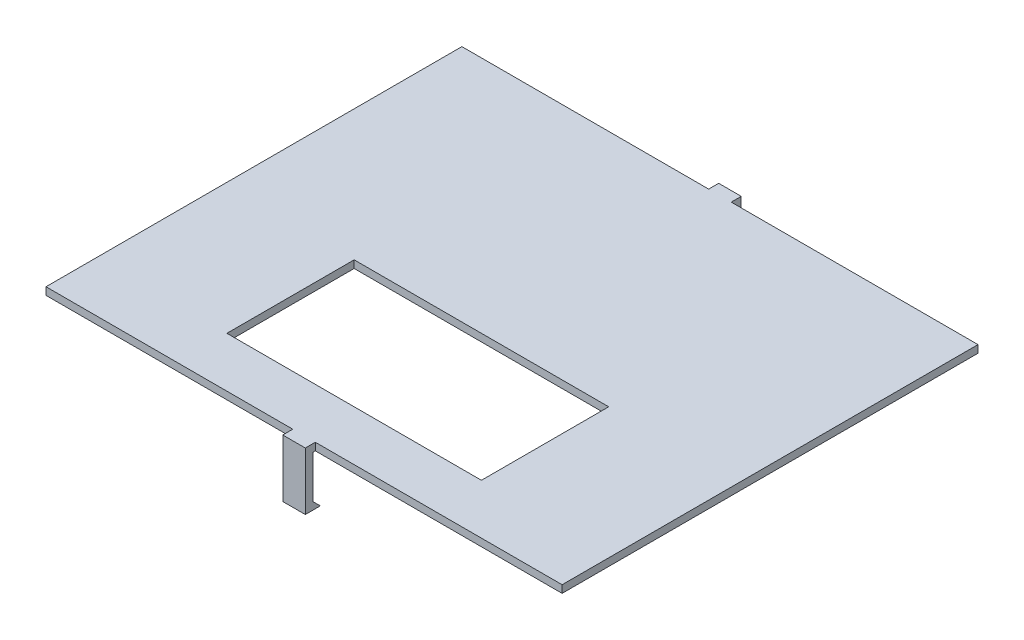
ISO-10303-21;
HEADER;
FILE_DESCRIPTION(('STEP AP214'),'2;1');
FILE_NAME('part.step','',(''),(''),'','','');
FILE_SCHEMA(('AUTOMOTIVE_DESIGN { 1 0 10303 214 1 1 1 1 }'));
ENDSEC;
DATA;
#1=APPLICATION_CONTEXT('core data for automotive mechanical design processes');
#2=APPLICATION_PROTOCOL_DEFINITION('international standard','automotive_design',2000,#1);
#3=PRODUCT_CONTEXT('',#1,'mechanical');
#4=PRODUCT('Part','Part','',(#3));
#5=PRODUCT_RELATED_PRODUCT_CATEGORY('part','',(#4));
#6=PRODUCT_DEFINITION_FORMATION('','',#4);
#7=PRODUCT_DEFINITION_CONTEXT('part definition',#1,'design');
#8=PRODUCT_DEFINITION('design','',#6,#7);
#9=PRODUCT_DEFINITION_SHAPE('','',#8);
#10=(LENGTH_UNIT() NAMED_UNIT(*) SI_UNIT(.MILLI.,.METRE.));
#11=(NAMED_UNIT(*) PLANE_ANGLE_UNIT() SI_UNIT($,.RADIAN.));
#12=(NAMED_UNIT(*) SI_UNIT($,.STERADIAN.) SOLID_ANGLE_UNIT());
#13=UNCERTAINTY_MEASURE_WITH_UNIT(LENGTH_MEASURE(1.E-05),#10,'distance_accuracy_value','');
#14=(GEOMETRIC_REPRESENTATION_CONTEXT(3) GLOBAL_UNCERTAINTY_ASSIGNED_CONTEXT((#13)) GLOBAL_UNIT_ASSIGNED_CONTEXT((#10,
#11,#12)) REPRESENTATION_CONTEXT('',''));
#15=CARTESIAN_POINT('',(0.,0.,0.));
#16=DIRECTION('',(0.,0.,1.));
#17=DIRECTION('',(1.,0.,0.));
#18=AXIS2_PLACEMENT_3D('',#15,#16,#17);
#19=CARTESIAN_POINT('',(-33.2076502732241,1.5,-29.4084699453552));
#20=DIRECTION('',(0.,0.,1.));
#21=DIRECTION('',(1.,0.,0.));
#22=AXIS2_PLACEMENT_3D('',#19,#20,#21);
#23=PLANE('',#22);
#24=DIRECTION('',(0.,-1.,0.));
#25=VECTOR('',#24,1.);
#26=CARTESIAN_POINT('',(20.5423497267759,0.,-29.4084699453552));
#27=LINE('',#26,#25);
#28=CARTESIAN_POINT('',(20.5423497267759,1.5,-29.4084699453552));
#29=VERTEX_POINT('',#28);
#30=CARTESIAN_POINT('',(20.5423497267759,0.,-29.4084699453552));
#31=VERTEX_POINT('',#30);
#32=EDGE_CURVE('E234',#29,#31,#27,.T.);
#33=ORIENTED_EDGE('',*,*,#32,.F.);
#34=DIRECTION('',(-1.,0.,0.));
#35=VECTOR('',#34,1.);
#36=CARTESIAN_POINT('',(-33.2076502732241,1.5,-29.4084699453552));
#37=LINE('',#36,#35);
#38=CARTESIAN_POINT('',(69.792349726776,1.5,-29.4084699453552));
#39=VERTEX_POINT('',#38);
#40=EDGE_CURVE('E325',#39,#29,#37,.T.);
#41=ORIENTED_EDGE('',*,*,#40,.F.);
#42=DIRECTION('',(0.,-1.,0.));
#43=VECTOR('',#42,1.);
#44=CARTESIAN_POINT('',(69.792349726776,1.5,-29.4084699453552));
#45=LINE('',#44,#43);
#46=CARTESIAN_POINT('',(69.792349726776,0.,-29.4084699453552));
#47=VERTEX_POINT('',#46);
#48=EDGE_CURVE('E340',#39,#47,#45,.T.);
#49=ORIENTED_EDGE('',*,*,#48,.T.);
#50=DIRECTION('',(-1.,0.,0.));
#51=VECTOR('',#50,1.);
#52=CARTESIAN_POINT('',(-33.2076502732241,0.,-29.4084699453552));
#53=LINE('',#52,#51);
#54=EDGE_CURVE('E318',#47,#31,#53,.T.);
#55=ORIENTED_EDGE('',*,*,#54,.T.);
#56=EDGE_LOOP('',(#33,#41,#49,#55));
#57=FACE_BOUND('',#56,.T.);
#58=ADVANCED_FACE('F33',(#57),#23,.F.);
#59=CARTESIAN_POINT('',(-33.207650273224,1.5,53.5915300546448));
#60=DIRECTION('',(0.,0.,-1.));
#61=DIRECTION('',(-1.,0.,0.));
#62=AXIS2_PLACEMENT_3D('',#59,#60,#61);
#63=PLANE('',#62);
#64=DIRECTION('',(0.,1.,0.));
#65=VECTOR('',#64,1.);
#66=CARTESIAN_POINT('',(16.042349726776,0.,53.5915300546448));
#67=LINE('',#66,#65);
#68=CARTESIAN_POINT('',(16.042349726776,0.,53.5915300546448));
#69=VERTEX_POINT('',#68);
#70=CARTESIAN_POINT('',(16.042349726776,1.5,53.5915300546448));
#71=VERTEX_POINT('',#70);
#72=EDGE_CURVE('E267',#69,#71,#67,.T.);
#73=ORIENTED_EDGE('',*,*,#72,.T.);
#74=DIRECTION('',(1.,0.,0.));
#75=VECTOR('',#74,1.);
#76=CARTESIAN_POINT('',(-33.207650273224,1.5,53.5915300546448));
#77=LINE('',#76,#75);
#78=CARTESIAN_POINT('',(-33.207650273224,1.5,53.5915300546448));
#79=VERTEX_POINT('',#78);
#80=EDGE_CURVE('E319',#79,#71,#77,.T.);
#81=ORIENTED_EDGE('',*,*,#80,.F.);
#82=DIRECTION('',(0.,-1.,0.));
#83=VECTOR('',#82,1.);
#84=CARTESIAN_POINT('',(-33.207650273224,1.5,53.5915300546448));
#85=LINE('',#84,#83);
#86=CARTESIAN_POINT('',(-33.207650273224,0.,53.5915300546448));
#87=VERTEX_POINT('',#86);
#88=EDGE_CURVE('E11',#79,#87,#85,.T.);
#89=ORIENTED_EDGE('',*,*,#88,.T.);
#90=DIRECTION('',(1.,0.,0.));
#91=VECTOR('',#90,1.);
#92=CARTESIAN_POINT('',(-33.207650273224,0.,53.5915300546448));
#93=LINE('',#92,#91);
#94=EDGE_CURVE('E332',#87,#69,#93,.T.);
#95=ORIENTED_EDGE('',*,*,#94,.T.);
#96=EDGE_LOOP('',(#73,#81,#89,#95));
#97=FACE_BOUND('',#96,.T.);
#98=ADVANCED_FACE('F383',(#97),#63,.F.);
#99=CARTESIAN_POINT('',(-33.2076502732241,1.5,-29.4084699453552));
#100=DIRECTION('',(1.,0.,0.));
#101=DIRECTION('',(0.,0.,-1.));
#102=AXIS2_PLACEMENT_3D('',#99,#100,#101);
#103=PLANE('',#102);
#104=DIRECTION('',(0.,0.,1.));
#105=VECTOR('',#104,1.);
#106=CARTESIAN_POINT('',(-33.2076502732241,0.,-29.4084699453552));
#107=LINE('',#106,#105);
#108=CARTESIAN_POINT('',(-33.2076502732241,0.,-29.4084699453552));
#109=VERTEX_POINT('',#108);
#110=EDGE_CURVE('E313',#109,#87,#107,.T.);
#111=ORIENTED_EDGE('',*,*,#110,.T.);
#112=ORIENTED_EDGE('',*,*,#88,.F.);
#113=DIRECTION('',(0.,0.,1.));
#114=VECTOR('',#113,1.);
#115=CARTESIAN_POINT('',(-33.2076502732241,1.5,-29.4084699453552));
#116=LINE('',#115,#114);
#117=CARTESIAN_POINT('',(-33.2076502732241,1.5,-29.4084699453552));
#118=VERTEX_POINT('',#117);
#119=EDGE_CURVE('E314',#118,#79,#116,.T.);
#120=ORIENTED_EDGE('',*,*,#119,.F.);
#121=DIRECTION('',(0.,-1.,0.));
#122=VECTOR('',#121,1.);
#123=CARTESIAN_POINT('',(-33.2076502732241,1.5,-29.4084699453552));
#124=LINE('',#123,#122);
#125=EDGE_CURVE('E328',#118,#109,#124,.T.);
#126=ORIENTED_EDGE('',*,*,#125,.T.);
#127=EDGE_LOOP('',(#111,#112,#120,#126));
#128=FACE_BOUND('',#127,.T.);
#129=ADVANCED_FACE('F35',(#128),#103,.F.);
#130=CARTESIAN_POINT('',(20.542349726776,1.5,53.5915300546448));
#131=VERTEX_POINT('',#130);
#132=CARTESIAN_POINT('',(69.792349726776,1.5,53.5915300546448));
#133=VERTEX_POINT('',#132);
#134=EDGE_CURVE('E317',#131,#133,#77,.T.);
#135=ORIENTED_EDGE('',*,*,#134,.F.);
#136=DIRECTION('',(0.,1.,0.));
#137=VECTOR('',#136,1.);
#138=CARTESIAN_POINT('',(20.542349726776,0.,53.5915300546448));
#139=LINE('',#138,#137);
#140=CARTESIAN_POINT('',(20.542349726776,0.,53.5915300546448));
#141=VERTEX_POINT('',#140);
#142=EDGE_CURVE('E268',#141,#131,#139,.T.);
#143=ORIENTED_EDGE('',*,*,#142,.F.);
#144=CARTESIAN_POINT('',(69.792349726776,0.,53.5915300546448));
#145=VERTEX_POINT('',#144);
#146=EDGE_CURVE('E331',#141,#145,#93,.T.);
#147=ORIENTED_EDGE('',*,*,#146,.T.);
#148=DIRECTION('',(0.,-1.,0.));
#149=VECTOR('',#148,1.);
#150=CARTESIAN_POINT('',(69.792349726776,1.5,53.5915300546448));
#151=LINE('',#150,#149);
#152=EDGE_CURVE('E41',#133,#145,#151,.T.);
#153=ORIENTED_EDGE('',*,*,#152,.F.);
#154=EDGE_LOOP('',(#135,#143,#147,#153));
#155=FACE_BOUND('',#154,.T.);
#156=ADVANCED_FACE('F368',(#155),#63,.F.);
#157=CARTESIAN_POINT('',(69.792349726776,1.5,-29.4084699453552));
#158=DIRECTION('',(-1.,0.,0.));
#159=DIRECTION('',(0.,0.,1.));
#160=AXIS2_PLACEMENT_3D('',#157,#158,#159);
#161=PLANE('',#160);
#162=DIRECTION('',(0.,0.,-1.));
#163=VECTOR('',#162,1.);
#164=CARTESIAN_POINT('',(69.792349726776,0.,-29.4084699453552));
#165=LINE('',#164,#163);
#166=EDGE_CURVE('E334',#145,#47,#165,.T.);
#167=ORIENTED_EDGE('',*,*,#166,.T.);
#168=ORIENTED_EDGE('',*,*,#48,.F.);
#169=DIRECTION('',(0.,0.,-1.));
#170=VECTOR('',#169,1.);
#171=CARTESIAN_POINT('',(69.792349726776,1.5,-29.4084699453552));
#172=LINE('',#171,#170);
#173=EDGE_CURVE('E322',#133,#39,#172,.T.);
#174=ORIENTED_EDGE('',*,*,#173,.F.);
#175=ORIENTED_EDGE('',*,*,#152,.T.);
#176=EDGE_LOOP('',(#167,#168,#174,#175));
#177=FACE_BOUND('',#176,.T.);
#178=ADVANCED_FACE('F347',(#177),#161,.F.);
#179=CARTESIAN_POINT('',(16.0423497267759,1.5,-29.4084699453552));
#180=VERTEX_POINT('',#179);
#181=EDGE_CURVE('E324',#180,#118,#37,.T.);
#182=ORIENTED_EDGE('',*,*,#181,.F.);
#183=DIRECTION('',(0.,-1.,0.));
#184=VECTOR('',#183,1.);
#185=CARTESIAN_POINT('',(16.0423497267759,0.,-29.4084699453552));
#186=LINE('',#185,#184);
#187=CARTESIAN_POINT('',(16.0423497267759,0.,-29.4084699453552));
#188=VERTEX_POINT('',#187);
#189=EDGE_CURVE('E223',#180,#188,#186,.T.);
#190=ORIENTED_EDGE('',*,*,#189,.T.);
#191=EDGE_CURVE('E336',#188,#109,#53,.T.);
#192=ORIENTED_EDGE('',*,*,#191,.T.);
#193=ORIENTED_EDGE('',*,*,#125,.F.);
#194=EDGE_LOOP('',(#182,#190,#192,#193));
#195=FACE_BOUND('',#194,.T.);
#196=ADVANCED_FACE('F391',(#195),#23,.F.);
#197=CARTESIAN_POINT('',(0.,1.5,0.));
#198=DIRECTION('',(0.,1.,0.));
#199=DIRECTION('',(0.,0.,1.));
#200=AXIS2_PLACEMENT_3D('',#197,#198,#199);
#201=PLANE('',#200);
#202=DIRECTION('',(0.,0.,1.));
#203=VECTOR('',#202,1.);
#204=CARTESIAN_POINT('',(-7.10765027322404,1.5,18.1915300546448));
#205=LINE('',#204,#203);
#206=CARTESIAN_POINT('',(-7.10765027322404,1.5,18.1915300546448));
#207=VERTEX_POINT('',#206);
#208=CARTESIAN_POINT('',(-7.10765027322404,1.5,43.5915300546448));
#209=VERTEX_POINT('',#208);
#210=EDGE_CURVE('E48',#207,#209,#205,.T.);
#211=ORIENTED_EDGE('',*,*,#210,.F.);
#212=DIRECTION('',(-1.,0.,0.));
#213=VECTOR('',#212,1.);
#214=CARTESIAN_POINT('',(-7.10765027322404,1.5,18.1915300546448));
#215=LINE('',#214,#213);
#216=CARTESIAN_POINT('',(43.692349726776,1.5,18.1915300546448));
#217=VERTEX_POINT('',#216);
#218=EDGE_CURVE('E200',#217,#207,#215,.T.);
#219=ORIENTED_EDGE('',*,*,#218,.F.);
#220=DIRECTION('',(0.,0.,-1.));
#221=VECTOR('',#220,1.);
#222=CARTESIAN_POINT('',(43.692349726776,1.5,18.1915300546448));
#223=LINE('',#222,#221);
#224=CARTESIAN_POINT('',(43.692349726776,1.5,43.5915300546448));
#225=VERTEX_POINT('',#224);
#226=EDGE_CURVE('E203',#225,#217,#223,.T.);
#227=ORIENTED_EDGE('',*,*,#226,.F.);
#228=DIRECTION('',(1.,0.,0.));
#229=VECTOR('',#228,1.);
#230=CARTESIAN_POINT('',(-7.10765027322404,1.5,43.5915300546448));
#231=LINE('',#230,#229);
#232=EDGE_CURVE('E209',#209,#225,#231,.T.);
#233=ORIENTED_EDGE('',*,*,#232,.F.);
#234=EDGE_LOOP('',(#211,#219,#227,#233));
#235=FACE_BOUND('',#234,.T.);
#236=ORIENTED_EDGE('',*,*,#119,.T.);
#237=ORIENTED_EDGE('',*,*,#80,.T.);
#238=DIRECTION('',(0.,0.,1.));
#239=VECTOR('',#238,1.);
#240=CARTESIAN_POINT('',(16.042349726776,1.5,53.5915300546448));
#241=LINE('',#240,#239);
#242=CARTESIAN_POINT('',(16.042349726776,1.5,55.5915300546448));
#243=VERTEX_POINT('',#242);
#244=EDGE_CURVE('E287',#71,#243,#241,.T.);
#245=ORIENTED_EDGE('',*,*,#244,.T.);
#246=DIRECTION('',(-1.,0.,0.));
#247=VECTOR('',#246,1.);
#248=CARTESIAN_POINT('',(20.542349726776,1.5,55.5915300546448));
#249=LINE('',#248,#247);
#250=CARTESIAN_POINT('',(20.542349726776,1.5,55.5915300546448));
#251=VERTEX_POINT('',#250);
#252=EDGE_CURVE('E310',#251,#243,#249,.T.);
#253=ORIENTED_EDGE('',*,*,#252,.F.);
#254=DIRECTION('',(0.,0.,1.));
#255=VECTOR('',#254,1.);
#256=CARTESIAN_POINT('',(20.542349726776,1.5,53.5915300546448));
#257=LINE('',#256,#255);
#258=EDGE_CURVE('E271',#131,#251,#257,.T.);
#259=ORIENTED_EDGE('',*,*,#258,.F.);
#260=ORIENTED_EDGE('',*,*,#134,.T.);
#261=ORIENTED_EDGE('',*,*,#173,.T.);
#262=ORIENTED_EDGE('',*,*,#40,.T.);
#263=DIRECTION('',(0.,0.,1.));
#264=VECTOR('',#263,1.);
#265=CARTESIAN_POINT('',(20.5423497267759,1.50000000000001,-29.4084699453552));
#266=LINE('',#265,#264);
#267=CARTESIAN_POINT('',(20.5423497267759,1.50000000000001,-31.4084699453552));
#268=VERTEX_POINT('',#267);
#269=EDGE_CURVE('E231',#268,#29,#266,.T.);
#270=ORIENTED_EDGE('',*,*,#269,.F.);
#271=DIRECTION('',(-1.,0.,0.));
#272=VECTOR('',#271,1.);
#273=CARTESIAN_POINT('',(20.5423497267759,1.50000000000001,-31.4084699453552));
#274=LINE('',#273,#272);
#275=CARTESIAN_POINT('',(16.0423497267759,1.50000000000001,-31.4084699453552));
#276=VERTEX_POINT('',#275);
#277=EDGE_CURVE('E237',#268,#276,#274,.T.);
#278=ORIENTED_EDGE('',*,*,#277,.T.);
#279=DIRECTION('',(0.,0.,1.));
#280=VECTOR('',#279,1.);
#281=CARTESIAN_POINT('',(16.0423497267759,1.50000000000001,-29.4084699453552));
#282=LINE('',#281,#280);
#283=EDGE_CURVE('E248',#276,#180,#282,.T.);
#284=ORIENTED_EDGE('',*,*,#283,.T.);
#285=ORIENTED_EDGE('',*,*,#181,.T.);
#286=EDGE_LOOP('',(#236,#237,#245,#253,#259,#260,#261,#262,#270,#278,#284,#285));
#287=FACE_BOUND('',#286,.T.);
#288=ADVANCED_FACE('F364',(#235,#287),#201,.T.);
#289=CARTESIAN_POINT('',(0.,0.,0.));
#290=DIRECTION('',(0.,1.,0.));
#291=DIRECTION('',(0.,0.,1.));
#292=AXIS2_PLACEMENT_3D('',#289,#290,#291);
#293=PLANE('',#292);
#294=DIRECTION('',(-1.,0.,0.));
#295=VECTOR('',#294,1.);
#296=CARTESIAN_POINT('',(-7.10765027322404,0.,18.1915300546448));
#297=LINE('',#296,#295);
#298=CARTESIAN_POINT('',(43.692349726776,0.,18.1915300546448));
#299=VERTEX_POINT('',#298);
#300=CARTESIAN_POINT('',(-7.10765027322404,0.,18.1915300546448));
#301=VERTEX_POINT('',#300);
#302=EDGE_CURVE('E190',#299,#301,#297,.T.);
#303=ORIENTED_EDGE('',*,*,#302,.T.);
#304=DIRECTION('',(0.,0.,1.));
#305=VECTOR('',#304,1.);
#306=CARTESIAN_POINT('',(-7.10765027322404,0.,18.1915300546448));
#307=LINE('',#306,#305);
#308=CARTESIAN_POINT('',(-7.10765027322404,0.,43.5915300546448));
#309=VERTEX_POINT('',#308);
#310=EDGE_CURVE('E184',#301,#309,#307,.T.);
#311=ORIENTED_EDGE('',*,*,#310,.T.);
#312=DIRECTION('',(1.,0.,0.));
#313=VECTOR('',#312,1.);
#314=CARTESIAN_POINT('',(-7.10765027322404,0.,43.5915300546448));
#315=LINE('',#314,#313);
#316=CARTESIAN_POINT('',(43.692349726776,0.,43.5915300546448));
#317=VERTEX_POINT('',#316);
#318=EDGE_CURVE('E193',#309,#317,#315,.T.);
#319=ORIENTED_EDGE('',*,*,#318,.T.);
#320=DIRECTION('',(0.,0.,-1.));
#321=VECTOR('',#320,1.);
#322=CARTESIAN_POINT('',(43.692349726776,0.,18.1915300546448));
#323=LINE('',#322,#321);
#324=EDGE_CURVE('E56',#317,#299,#323,.T.);
#325=ORIENTED_EDGE('',*,*,#324,.T.);
#326=EDGE_LOOP('',(#303,#311,#319,#325));
#327=FACE_BOUND('',#326,.T.);
#328=ORIENTED_EDGE('',*,*,#110,.F.);
#329=ORIENTED_EDGE('',*,*,#191,.F.);
#330=DIRECTION('',(0.,0.,-1.));
#331=VECTOR('',#330,1.);
#332=CARTESIAN_POINT('',(16.0423497267759,0.,-29.9084699453552));
#333=LINE('',#332,#331);
#334=CARTESIAN_POINT('',(16.0423497267759,0.,-29.9084699453552));
#335=VERTEX_POINT('',#334);
#336=EDGE_CURVE('E215',#188,#335,#333,.T.);
#337=ORIENTED_EDGE('',*,*,#336,.T.);
#338=DIRECTION('',(-1.,0.,0.));
#339=VECTOR('',#338,1.);
#340=CARTESIAN_POINT('',(20.5423497267759,0.,-29.9084699453552));
#341=LINE('',#340,#339);
#342=CARTESIAN_POINT('',(20.5423497267759,0.,-29.9084699453552));
#343=VERTEX_POINT('',#342);
#344=EDGE_CURVE('E264',#343,#335,#341,.T.);
#345=ORIENTED_EDGE('',*,*,#344,.F.);
#346=DIRECTION('',(0.,0.,-1.));
#347=VECTOR('',#346,1.);
#348=CARTESIAN_POINT('',(20.5423497267759,0.,-29.9084699453552));
#349=LINE('',#348,#347);
#350=EDGE_CURVE('E219',#31,#343,#349,.T.);
#351=ORIENTED_EDGE('',*,*,#350,.F.);
#352=ORIENTED_EDGE('',*,*,#54,.F.);
#353=ORIENTED_EDGE('',*,*,#166,.F.);
#354=ORIENTED_EDGE('',*,*,#146,.F.);
#355=DIRECTION('',(0.,0.,-1.));
#356=VECTOR('',#355,1.);
#357=CARTESIAN_POINT('',(20.542349726776,0.,54.0915300546448));
#358=LINE('',#357,#356);
#359=CARTESIAN_POINT('',(20.542349726776,0.,54.0915300546448));
#360=VERTEX_POINT('',#359);
#361=EDGE_CURVE('E282',#360,#141,#358,.T.);
#362=ORIENTED_EDGE('',*,*,#361,.F.);
#363=DIRECTION('',(-1.,0.,0.));
#364=VECTOR('',#363,1.);
#365=CARTESIAN_POINT('',(20.542349726776,0.,54.0915300546448));
#366=LINE('',#365,#364);
#367=CARTESIAN_POINT('',(16.042349726776,0.,54.0915300546448));
#368=VERTEX_POINT('',#367);
#369=EDGE_CURVE('E285',#360,#368,#366,.T.);
#370=ORIENTED_EDGE('',*,*,#369,.T.);
#371=DIRECTION('',(0.,0.,-1.));
#372=VECTOR('',#371,1.);
#373=CARTESIAN_POINT('',(16.042349726776,0.,54.0915300546448));
#374=LINE('',#373,#372);
#375=EDGE_CURVE('E272',#368,#69,#374,.T.);
#376=ORIENTED_EDGE('',*,*,#375,.T.);
#377=ORIENTED_EDGE('',*,*,#94,.F.);
#378=EDGE_LOOP('',(#328,#329,#337,#345,#351,#352,#353,#354,#362,#370,#376,#377));
#379=FACE_BOUND('',#378,.T.);
#380=ADVANCED_FACE('F197',(#327,#379),#293,.F.);
#381=CARTESIAN_POINT('',(20.542349726776,1.5,55.5915300546448));
#382=DIRECTION('',(0.,0.,-1.));
#383=DIRECTION('',(-1.,0.,0.));
#384=AXIS2_PLACEMENT_3D('',#381,#382,#383);
#385=PLANE('',#384);
#386=DIRECTION('',(0.,-1.,0.));
#387=VECTOR('',#386,1.);
#388=CARTESIAN_POINT('',(16.042349726776,1.5,55.5915300546448));
#389=LINE('',#388,#387);
#390=CARTESIAN_POINT('',(16.042349726776,-10.,55.5915300546448));
#391=VERTEX_POINT('',#390);
#392=EDGE_CURVE('E289',#243,#391,#389,.T.);
#393=ORIENTED_EDGE('',*,*,#392,.T.);
#394=DIRECTION('',(-1.,0.,0.));
#395=VECTOR('',#394,1.);
#396=CARTESIAN_POINT('',(20.542349726776,-10.,55.5915300546448));
#397=LINE('',#396,#395);
#398=CARTESIAN_POINT('',(20.542349726776,-10.,55.5915300546448));
#399=VERTEX_POINT('',#398);
#400=EDGE_CURVE('E307',#399,#391,#397,.T.);
#401=ORIENTED_EDGE('',*,*,#400,.F.);
#402=DIRECTION('',(0.,-1.,0.));
#403=VECTOR('',#402,1.);
#404=CARTESIAN_POINT('',(20.542349726776,1.5,55.5915300546448));
#405=LINE('',#404,#403);
#406=EDGE_CURVE('E274',#251,#399,#405,.T.);
#407=ORIENTED_EDGE('',*,*,#406,.F.);
#408=ORIENTED_EDGE('',*,*,#252,.T.);
#409=EDGE_LOOP('',(#393,#401,#407,#408));
#410=FACE_BOUND('',#409,.T.);
#411=ADVANCED_FACE('F464',(#410),#385,.F.);
#412=CARTESIAN_POINT('',(20.542349726776,-10.,55.5915300546448));
#413=DIRECTION('',(0.,1.,0.));
#414=DIRECTION('',(0.,0.,1.));
#415=AXIS2_PLACEMENT_3D('',#412,#413,#414);
#416=PLANE('',#415);
#417=DIRECTION('',(0.,0.,-1.));
#418=VECTOR('',#417,1.);
#419=CARTESIAN_POINT('',(16.042349726776,-10.,55.5915300546448));
#420=LINE('',#419,#418);
#421=CARTESIAN_POINT('',(16.042349726776,-10.,52.5924636785293));
#422=VERTEX_POINT('',#421);
#423=EDGE_CURVE('E291',#391,#422,#420,.T.);
#424=ORIENTED_EDGE('',*,*,#423,.T.);
#425=DIRECTION('',(-1.,0.,0.));
#426=VECTOR('',#425,1.);
#427=CARTESIAN_POINT('',(20.542349726776,-10.,52.5924636785293));
#428=LINE('',#427,#426);
#429=CARTESIAN_POINT('',(20.542349726776,-10.,52.5924636785293));
#430=VERTEX_POINT('',#429);
#431=EDGE_CURVE('E304',#430,#422,#428,.T.);
#432=ORIENTED_EDGE('',*,*,#431,.F.);
#433=DIRECTION('',(0.,0.,-1.));
#434=VECTOR('',#433,1.);
#435=CARTESIAN_POINT('',(20.542349726776,-10.,55.5915300546448));
#436=LINE('',#435,#434);
#437=EDGE_CURVE('E276',#399,#430,#436,.T.);
#438=ORIENTED_EDGE('',*,*,#437,.F.);
#439=ORIENTED_EDGE('',*,*,#400,.T.);
#440=EDGE_LOOP('',(#424,#432,#438,#439));
#441=FACE_BOUND('',#440,.T.);
#442=ADVANCED_FACE('F469',(#441),#416,.F.);
#443=CARTESIAN_POINT('',(20.542349726776,-10.,52.5924636785293));
#444=DIRECTION('',(0.,-0.707106781186552,0.707106781186543));
#445=DIRECTION('',(0.,-0.707106781186543,-0.707106781186552));
#446=AXIS2_PLACEMENT_3D('',#443,#444,#445);
#447=PLANE('',#446);
#448=DIRECTION('',(0.,0.707106781186543,0.707106781186552));
#449=VECTOR('',#448,1.);
#450=CARTESIAN_POINT('',(16.042349726776,-10.,52.5924636785293));
#451=LINE('',#450,#449);
#452=CARTESIAN_POINT('',(16.042349726776,-8.50093362388453,54.0915300546448));
#453=VERTEX_POINT('',#452);
#454=EDGE_CURVE('E293',#422,#453,#451,.T.);
#455=ORIENTED_EDGE('',*,*,#454,.T.);
#456=DIRECTION('',(-1.,0.,0.));
#457=VECTOR('',#456,1.);
#458=CARTESIAN_POINT('',(20.542349726776,-8.50093362388453,54.0915300546448));
#459=LINE('',#458,#457);
#460=CARTESIAN_POINT('',(20.542349726776,-8.50093362388453,54.0915300546448));
#461=VERTEX_POINT('',#460);
#462=EDGE_CURVE('E301',#461,#453,#459,.T.);
#463=ORIENTED_EDGE('',*,*,#462,.F.);
#464=DIRECTION('',(0.,0.707106781186543,0.707106781186552));
#465=VECTOR('',#464,1.);
#466=CARTESIAN_POINT('',(20.542349726776,-10.,52.5924636785293));
#467=LINE('',#466,#465);
#468=EDGE_CURVE('E278',#430,#461,#467,.T.);
#469=ORIENTED_EDGE('',*,*,#468,.F.);
#470=ORIENTED_EDGE('',*,*,#431,.T.);
#471=EDGE_LOOP('',(#455,#463,#469,#470));
#472=FACE_BOUND('',#471,.T.);
#473=ADVANCED_FACE('F481',(#472),#447,.F.);
#474=CARTESIAN_POINT('',(20.542349726776,-8.50093362388453,54.0915300546448));
#475=DIRECTION('',(0.,0.,1.));
#476=DIRECTION('',(1.,0.,0.));
#477=AXIS2_PLACEMENT_3D('',#474,#475,#476);
#478=PLANE('',#477);
#479=DIRECTION('',(0.,1.,0.));
#480=VECTOR('',#479,1.);
#481=CARTESIAN_POINT('',(16.042349726776,-8.50093362388453,54.0915300546448));
#482=LINE('',#481,#480);
#483=EDGE_CURVE('E295',#453,#368,#482,.T.);
#484=ORIENTED_EDGE('',*,*,#483,.T.);
#485=ORIENTED_EDGE('',*,*,#369,.F.);
#486=DIRECTION('',(0.,1.,0.));
#487=VECTOR('',#486,1.);
#488=CARTESIAN_POINT('',(20.542349726776,-8.50093362388453,54.0915300546448));
#489=LINE('',#488,#487);
#490=EDGE_CURVE('E280',#461,#360,#489,.T.);
#491=ORIENTED_EDGE('',*,*,#490,.F.);
#492=ORIENTED_EDGE('',*,*,#462,.T.);
#493=EDGE_LOOP('',(#484,#485,#491,#492));
#494=FACE_BOUND('',#493,.T.);
#495=ADVANCED_FACE('F491',(#494),#478,.F.);
#496=CARTESIAN_POINT('',(20.542349726776,0.,0.));
#497=DIRECTION('',(1.,0.,0.));
#498=DIRECTION('',(0.,0.,-1.));
#499=AXIS2_PLACEMENT_3D('',#496,#497,#498);
#500=PLANE('',#499);
#501=ORIENTED_EDGE('',*,*,#142,.T.);
#502=ORIENTED_EDGE('',*,*,#258,.T.);
#503=ORIENTED_EDGE('',*,*,#406,.T.);
#504=ORIENTED_EDGE('',*,*,#437,.T.);
#505=ORIENTED_EDGE('',*,*,#468,.T.);
#506=ORIENTED_EDGE('',*,*,#490,.T.);
#507=ORIENTED_EDGE('',*,*,#361,.T.);
#508=EDGE_LOOP('',(#501,#502,#503,#504,#505,#506,#507));
#509=FACE_BOUND('',#508,.T.);
#510=ADVANCED_FACE('F370',(#509),#500,.T.);
#511=CARTESIAN_POINT('',(16.042349726776,0.,0.));
#512=DIRECTION('',(1.,0.,0.));
#513=DIRECTION('',(0.,0.,-1.));
#514=AXIS2_PLACEMENT_3D('',#511,#512,#513);
#515=PLANE('',#514);
#516=ORIENTED_EDGE('',*,*,#72,.F.);
#517=ORIENTED_EDGE('',*,*,#375,.F.);
#518=ORIENTED_EDGE('',*,*,#483,.F.);
#519=ORIENTED_EDGE('',*,*,#454,.F.);
#520=ORIENTED_EDGE('',*,*,#423,.F.);
#521=ORIENTED_EDGE('',*,*,#392,.F.);
#522=ORIENTED_EDGE('',*,*,#244,.F.);
#523=EDGE_LOOP('',(#516,#517,#518,#519,#520,#521,#522));
#524=FACE_BOUND('',#523,.T.);
#525=ADVANCED_FACE('F378',(#524),#515,.F.);
#526=CARTESIAN_POINT('',(20.5423497267759,-8.50093362388452,-29.9084699453552));
#527=DIRECTION('',(0.,0.,-1.));
#528=DIRECTION('',(-1.,0.,0.));
#529=AXIS2_PLACEMENT_3D('',#526,#527,#528);
#530=PLANE('',#529);
#531=DIRECTION('',(0.,-1.,0.));
#532=VECTOR('',#531,1.);
#533=CARTESIAN_POINT('',(16.0423497267759,-8.50093362388452,-29.9084699453552));
#534=LINE('',#533,#532);
#535=CARTESIAN_POINT('',(16.0423497267759,-8.50093362388452,-29.9084699453552));
#536=VERTEX_POINT('',#535);
#537=EDGE_CURVE('E240',#335,#536,#534,.T.);
#538=ORIENTED_EDGE('',*,*,#537,.T.);
#539=DIRECTION('',(-1.,0.,0.));
#540=VECTOR('',#539,1.);
#541=CARTESIAN_POINT('',(20.5423497267759,-8.50093362388452,-29.9084699453552));
#542=LINE('',#541,#540);
#543=CARTESIAN_POINT('',(20.5423497267759,-8.50093362388452,-29.9084699453552));
#544=VERTEX_POINT('',#543);
#545=EDGE_CURVE('E261',#544,#536,#542,.T.);
#546=ORIENTED_EDGE('',*,*,#545,.F.);
#547=DIRECTION('',(0.,-1.,0.));
#548=VECTOR('',#547,1.);
#549=CARTESIAN_POINT('',(20.5423497267759,-8.50093362388452,-29.9084699453552));
#550=LINE('',#549,#548);
#551=EDGE_CURVE('E222',#343,#544,#550,.T.);
#552=ORIENTED_EDGE('',*,*,#551,.F.);
#553=ORIENTED_EDGE('',*,*,#344,.T.);
#554=EDGE_LOOP('',(#538,#546,#552,#553));
#555=FACE_BOUND('',#554,.T.);
#556=ADVANCED_FACE('F398',(#555),#530,.F.);
#557=CARTESIAN_POINT('',(20.5423497267759,-9.99999999999999,-28.4094035692397));
#558=DIRECTION('',(0.,-0.707106781186552,-0.707106781186543));
#559=DIRECTION('',(0.,0.707106781186543,-0.707106781186552));
#560=AXIS2_PLACEMENT_3D('',#557,#558,#559);
#561=PLANE('',#560);
#562=DIRECTION('',(0.,-0.707106781186543,0.707106781186552));
#563=VECTOR('',#562,1.);
#564=CARTESIAN_POINT('',(16.0423497267759,-9.99999999999999,-28.4094035692397));
#565=LINE('',#564,#563);
#566=CARTESIAN_POINT('',(16.0423497267759,-9.99999999999999,-28.4094035692397));
#567=VERTEX_POINT('',#566);
#568=EDGE_CURVE('E242',#536,#567,#565,.T.);
#569=ORIENTED_EDGE('',*,*,#568,.T.);
#570=DIRECTION('',(-1.,0.,0.));
#571=VECTOR('',#570,1.);
#572=CARTESIAN_POINT('',(20.5423497267759,-9.99999999999999,-28.4094035692397));
#573=LINE('',#572,#571);
#574=CARTESIAN_POINT('',(20.5423497267759,-9.99999999999999,-28.4094035692397));
#575=VERTEX_POINT('',#574);
#576=EDGE_CURVE('E258',#575,#567,#573,.T.);
#577=ORIENTED_EDGE('',*,*,#576,.F.);
#578=DIRECTION('',(0.,-0.707106781186543,0.707106781186552));
#579=VECTOR('',#578,1.);
#580=CARTESIAN_POINT('',(20.5423497267759,-9.99999999999999,-28.4094035692397));
#581=LINE('',#580,#579);
#582=EDGE_CURVE('E225',#544,#575,#581,.T.);
#583=ORIENTED_EDGE('',*,*,#582,.F.);
#584=ORIENTED_EDGE('',*,*,#545,.T.);
#585=EDGE_LOOP('',(#569,#577,#583,#584));
#586=FACE_BOUND('',#585,.T.);
#587=ADVANCED_FACE('F404',(#586),#561,.F.);
#588=CARTESIAN_POINT('',(20.5423497267759,-9.99999999999999,-31.4084699453552));
#589=DIRECTION('',(0.,1.,0.));
#590=DIRECTION('',(0.,0.,1.));
#591=AXIS2_PLACEMENT_3D('',#588,#589,#590);
#592=PLANE('',#591);
#593=DIRECTION('',(0.,0.,-1.));
#594=VECTOR('',#593,1.);
#595=CARTESIAN_POINT('',(16.0423497267759,-9.99999999999999,-31.4084699453552));
#596=LINE('',#595,#594);
#597=CARTESIAN_POINT('',(16.0423497267759,-9.99999999999999,-31.4084699453552));
#598=VERTEX_POINT('',#597);
#599=EDGE_CURVE('E244',#567,#598,#596,.T.);
#600=ORIENTED_EDGE('',*,*,#599,.T.);
#601=DIRECTION('',(-1.,0.,0.));
#602=VECTOR('',#601,1.);
#603=CARTESIAN_POINT('',(20.5423497267759,-9.99999999999999,-31.4084699453552));
#604=LINE('',#603,#602);
#605=CARTESIAN_POINT('',(20.5423497267759,-9.99999999999999,-31.4084699453552));
#606=VERTEX_POINT('',#605);
#607=EDGE_CURVE('E255',#606,#598,#604,.T.);
#608=ORIENTED_EDGE('',*,*,#607,.F.);
#609=DIRECTION('',(0.,0.,-1.));
#610=VECTOR('',#609,1.);
#611=CARTESIAN_POINT('',(20.5423497267759,-9.99999999999999,-31.4084699453552));
#612=LINE('',#611,#610);
#613=EDGE_CURVE('E227',#575,#606,#612,.T.);
#614=ORIENTED_EDGE('',*,*,#613,.F.);
#615=ORIENTED_EDGE('',*,*,#576,.T.);
#616=EDGE_LOOP('',(#600,#608,#614,#615));
#617=FACE_BOUND('',#616,.T.);
#618=ADVANCED_FACE('F406',(#617),#592,.F.);
#619=CARTESIAN_POINT('',(20.5423497267759,1.50000000000001,-31.4084699453552));
#620=DIRECTION('',(0.,0.,1.));
#621=DIRECTION('',(1.,0.,0.));
#622=AXIS2_PLACEMENT_3D('',#619,#620,#621);
#623=PLANE('',#622);
#624=DIRECTION('',(0.,1.,0.));
#625=VECTOR('',#624,1.);
#626=CARTESIAN_POINT('',(16.0423497267759,1.50000000000001,-31.4084699453552));
#627=LINE('',#626,#625);
#628=EDGE_CURVE('E246',#598,#276,#627,.T.);
#629=ORIENTED_EDGE('',*,*,#628,.T.);
#630=ORIENTED_EDGE('',*,*,#277,.F.);
#631=DIRECTION('',(0.,1.,0.));
#632=VECTOR('',#631,1.);
#633=CARTESIAN_POINT('',(20.5423497267759,1.50000000000001,-31.4084699453552));
#634=LINE('',#633,#632);
#635=EDGE_CURVE('E229',#606,#268,#634,.T.);
#636=ORIENTED_EDGE('',*,*,#635,.F.);
#637=ORIENTED_EDGE('',*,*,#607,.T.);
#638=EDGE_LOOP('',(#629,#630,#636,#637));
#639=FACE_BOUND('',#638,.T.);
#640=ADVANCED_FACE('F409',(#639),#623,.F.);
#641=CARTESIAN_POINT('',(20.5423497267762,0.,-1.27587032916823E-13));
#642=DIRECTION('',(-1.,0.,0.));
#643=DIRECTION('',(0.,0.,1.));
#644=AXIS2_PLACEMENT_3D('',#641,#642,#643);
#645=PLANE('',#644);
#646=ORIENTED_EDGE('',*,*,#350,.T.);
#647=ORIENTED_EDGE('',*,*,#551,.T.);
#648=ORIENTED_EDGE('',*,*,#582,.T.);
#649=ORIENTED_EDGE('',*,*,#613,.T.);
#650=ORIENTED_EDGE('',*,*,#635,.T.);
#651=ORIENTED_EDGE('',*,*,#269,.T.);
#652=ORIENTED_EDGE('',*,*,#32,.T.);
#653=EDGE_LOOP('',(#646,#647,#648,#649,#650,#651,#652));
#654=FACE_BOUND('',#653,.T.);
#655=ADVANCED_FACE('F359',(#654),#645,.F.);
#656=CARTESIAN_POINT('',(16.0423497267762,0.,-1.26270315097709E-13));
#657=DIRECTION('',(-1.,0.,0.));
#658=DIRECTION('',(0.,0.,1.));
#659=AXIS2_PLACEMENT_3D('',#656,#657,#658);
#660=PLANE('',#659);
#661=ORIENTED_EDGE('',*,*,#336,.F.);
#662=ORIENTED_EDGE('',*,*,#189,.F.);
#663=ORIENTED_EDGE('',*,*,#283,.F.);
#664=ORIENTED_EDGE('',*,*,#628,.F.);
#665=ORIENTED_EDGE('',*,*,#599,.F.);
#666=ORIENTED_EDGE('',*,*,#568,.F.);
#667=ORIENTED_EDGE('',*,*,#537,.F.);
#668=EDGE_LOOP('',(#661,#662,#663,#664,#665,#666,#667));
#669=FACE_BOUND('',#668,.T.);
#670=ADVANCED_FACE('F393',(#669),#660,.T.);
#671=CARTESIAN_POINT('',(-7.10765027322404,0.,18.1915300546448));
#672=DIRECTION('',(-1.,0.,0.));
#673=DIRECTION('',(0.,0.,1.));
#674=AXIS2_PLACEMENT_3D('',#671,#672,#673);
#675=PLANE('',#674);
#676=ORIENTED_EDGE('',*,*,#210,.T.);
#677=DIRECTION('',(0.,1.,0.));
#678=VECTOR('',#677,1.);
#679=CARTESIAN_POINT('',(-7.10765027322404,0.,43.5915300546448));
#680=LINE('',#679,#678);
#681=EDGE_CURVE('E180',#309,#209,#680,.T.);
#682=ORIENTED_EDGE('',*,*,#681,.F.);
#683=ORIENTED_EDGE('',*,*,#310,.F.);
#684=DIRECTION('',(0.,1.,0.));
#685=VECTOR('',#684,1.);
#686=CARTESIAN_POINT('',(-7.10765027322404,0.,18.1915300546448));
#687=LINE('',#686,#685);
#688=EDGE_CURVE('E213',#301,#207,#687,.T.);
#689=ORIENTED_EDGE('',*,*,#688,.T.);
#690=EDGE_LOOP('',(#676,#682,#683,#689));
#691=FACE_BOUND('',#690,.T.);
#692=ADVANCED_FACE('F182',(#691),#675,.F.);
#693=CARTESIAN_POINT('',(-7.10765027322404,0.,18.1915300546448));
#694=DIRECTION('',(0.,0.,-1.));
#695=DIRECTION('',(-1.,0.,0.));
#696=AXIS2_PLACEMENT_3D('',#693,#694,#695);
#697=PLANE('',#696);
#698=ORIENTED_EDGE('',*,*,#218,.T.);
#699=ORIENTED_EDGE('',*,*,#688,.F.);
#700=ORIENTED_EDGE('',*,*,#302,.F.);
#701=DIRECTION('',(0.,1.,0.));
#702=VECTOR('',#701,1.);
#703=CARTESIAN_POINT('',(43.692349726776,0.,18.1915300546448));
#704=LINE('',#703,#702);
#705=EDGE_CURVE('E216',#299,#217,#704,.T.);
#706=ORIENTED_EDGE('',*,*,#705,.T.);
#707=EDGE_LOOP('',(#698,#699,#700,#706));
#708=FACE_BOUND('',#707,.T.);
#709=ADVANCED_FACE('F570',(#708),#697,.F.);
#710=CARTESIAN_POINT('',(43.692349726776,0.,18.1915300546448));
#711=DIRECTION('',(1.,0.,0.));
#712=DIRECTION('',(0.,0.,-1.));
#713=AXIS2_PLACEMENT_3D('',#710,#711,#712);
#714=PLANE('',#713);
#715=ORIENTED_EDGE('',*,*,#226,.T.);
#716=ORIENTED_EDGE('',*,*,#705,.F.);
#717=ORIENTED_EDGE('',*,*,#324,.F.);
#718=DIRECTION('',(0.,1.,0.));
#719=VECTOR('',#718,1.);
#720=CARTESIAN_POINT('',(43.692349726776,0.,43.5915300546448));
#721=LINE('',#720,#719);
#722=EDGE_CURVE('E189',#317,#225,#721,.T.);
#723=ORIENTED_EDGE('',*,*,#722,.T.);
#724=EDGE_LOOP('',(#715,#716,#717,#723));
#725=FACE_BOUND('',#724,.T.);
#726=ADVANCED_FACE('F579',(#725),#714,.F.);
#727=CARTESIAN_POINT('',(-7.10765027322404,0.,43.5915300546448));
#728=DIRECTION('',(0.,0.,1.));
#729=DIRECTION('',(1.,0.,0.));
#730=AXIS2_PLACEMENT_3D('',#727,#728,#729);
#731=PLANE('',#730);
#732=ORIENTED_EDGE('',*,*,#232,.T.);
#733=ORIENTED_EDGE('',*,*,#722,.F.);
#734=ORIENTED_EDGE('',*,*,#318,.F.);
#735=ORIENTED_EDGE('',*,*,#681,.T.);
#736=EDGE_LOOP('',(#732,#733,#734,#735));
#737=FACE_BOUND('',#736,.T.);
#738=ADVANCED_FACE('F194',(#737),#731,.F.);
#739=CLOSED_SHELL('',(#58,#98,#129,#156,#178,#196,#288,#380,#411,#442,#473,#495,#510,#525,#556,
#587,#618,#640,#655,#670,#692,#709,#726,#738));
#740=MANIFOLD_SOLID_BREP('B2',#739);
#741=ADVANCED_BREP_SHAPE_REPRESENTATION('',(#18,#740),#14);
#742=SHAPE_DEFINITION_REPRESENTATION(#9,#741);
ENDSEC;
END-ISO-10303-21;
